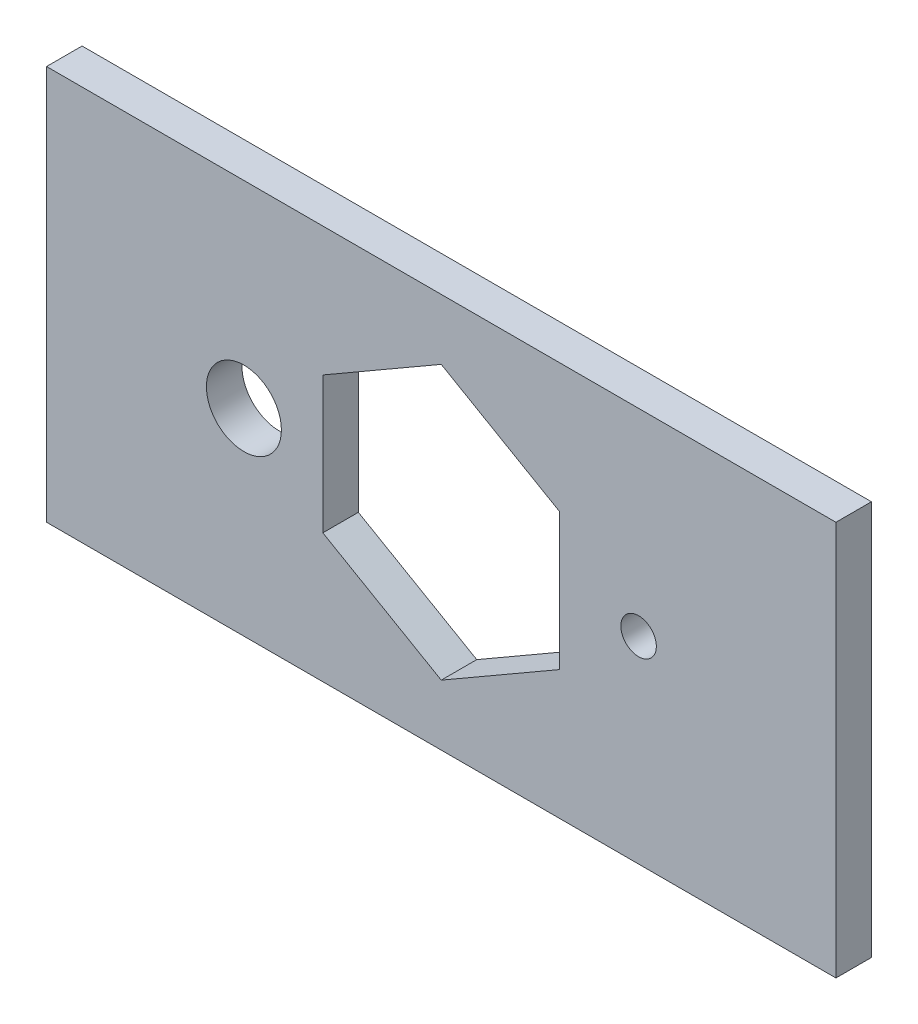
ISO-10303-21;
HEADER;
FILE_DESCRIPTION(('STEP AP214'),'2;1');
FILE_NAME('part.step','',(''),(''),'','','');
FILE_SCHEMA(('AUTOMOTIVE_DESIGN { 1 0 10303 214 1 1 1 1 }'));
ENDSEC;
DATA;
#1=APPLICATION_CONTEXT('core data for automotive mechanical design processes');
#2=APPLICATION_PROTOCOL_DEFINITION('international standard','automotive_design',2000,#1);
#3=PRODUCT_CONTEXT('',#1,'mechanical');
#4=PRODUCT('Part','Part','',(#3));
#5=PRODUCT_RELATED_PRODUCT_CATEGORY('part','',(#4));
#6=PRODUCT_DEFINITION_FORMATION('','',#4);
#7=PRODUCT_DEFINITION_CONTEXT('part definition',#1,'design');
#8=PRODUCT_DEFINITION('design','',#6,#7);
#9=PRODUCT_DEFINITION_SHAPE('','',#8);
#10=(LENGTH_UNIT() NAMED_UNIT(*) SI_UNIT(.MILLI.,.METRE.));
#11=(NAMED_UNIT(*) PLANE_ANGLE_UNIT() SI_UNIT($,.RADIAN.));
#12=(NAMED_UNIT(*) SI_UNIT($,.STERADIAN.) SOLID_ANGLE_UNIT());
#13=UNCERTAINTY_MEASURE_WITH_UNIT(LENGTH_MEASURE(1.E-05),#10,'distance_accuracy_value','');
#14=(GEOMETRIC_REPRESENTATION_CONTEXT(3) GLOBAL_UNCERTAINTY_ASSIGNED_CONTEXT((#13)) GLOBAL_UNIT_ASSIGNED_CONTEXT((#10,
#11,#12)) REPRESENTATION_CONTEXT('',''));
#15=CARTESIAN_POINT('',(0.,0.,0.));
#16=DIRECTION('',(0.,0.,1.));
#17=DIRECTION('',(1.,0.,0.));
#18=AXIS2_PLACEMENT_3D('',#15,#16,#17);
#19=CARTESIAN_POINT('',(0.,0.,1.143));
#20=DIRECTION('',(0.,0.,-1.));
#21=DIRECTION('',(-1.,0.,0.));
#22=AXIS2_PLACEMENT_3D('',#19,#20,#21);
#23=PLANE('',#22);
#24=CARTESIAN_POINT('',(-12.7,0.,1.143));
#25=DIRECTION('',(0.,0.,1.));
#26=DIRECTION('',(1.,0.,0.));
#27=AXIS2_PLACEMENT_3D('',#24,#25,#26);
#28=CIRCLE('',#27,2.413);
#29=CARTESIAN_POINT('',(-10.287,0.,1.143));
#30=VERTEX_POINT('',#29);
#31=EDGE_CURVE('E146',#30,#30,#28,.T.);
#32=ORIENTED_EDGE('',*,*,#31,.F.);
#33=EDGE_LOOP('',(#32));
#34=FACE_BOUND('',#33,.T.);
#35=DIRECTION('',(0.,1.,0.));
#36=VECTOR('',#35,1.);
#37=CARTESIAN_POINT('',(25.4,12.7,1.143));
#38=LINE('',#37,#36);
#39=CARTESIAN_POINT('',(25.4,-12.7,1.143));
#40=VERTEX_POINT('',#39);
#41=CARTESIAN_POINT('',(25.4,12.7,1.143));
#42=VERTEX_POINT('',#41);
#43=EDGE_CURVE('E166',#40,#42,#38,.T.);
#44=ORIENTED_EDGE('',*,*,#43,.T.);
#45=DIRECTION('',(-1.,0.,0.));
#46=VECTOR('',#45,1.);
#47=CARTESIAN_POINT('',(25.4,12.7,1.143));
#48=LINE('',#47,#46);
#49=CARTESIAN_POINT('',(-25.4,12.7,1.143));
#50=VERTEX_POINT('',#49);
#51=EDGE_CURVE('E169',#42,#50,#48,.T.);
#52=ORIENTED_EDGE('',*,*,#51,.T.);
#53=DIRECTION('',(0.,-1.,0.));
#54=VECTOR('',#53,1.);
#55=CARTESIAN_POINT('',(-25.4,12.7,1.143));
#56=LINE('',#55,#54);
#57=CARTESIAN_POINT('',(-25.4,-12.7,1.143));
#58=VERTEX_POINT('',#57);
#59=EDGE_CURVE('E172',#50,#58,#56,.T.);
#60=ORIENTED_EDGE('',*,*,#59,.T.);
#61=DIRECTION('',(1.,0.,0.));
#62=VECTOR('',#61,1.);
#63=CARTESIAN_POINT('',(25.4,-12.7,1.143));
#64=LINE('',#63,#62);
#65=EDGE_CURVE('E174',#58,#40,#64,.T.);
#66=ORIENTED_EDGE('',*,*,#65,.T.);
#67=EDGE_LOOP('',(#44,#52,#60,#66));
#68=FACE_BOUND('',#67,.T.);
#69=DIRECTION('',(0.,1.,0.));
#70=VECTOR('',#69,1.);
#71=CARTESIAN_POINT('',(7.62,-4.39940905122495,1.143));
#72=LINE('',#71,#70);
#73=CARTESIAN_POINT('',(7.62,-4.39940905122495,1.143));
#74=VERTEX_POINT('',#73);
#75=CARTESIAN_POINT('',(7.62,4.39940905122495,1.143));
#76=VERTEX_POINT('',#75);
#77=EDGE_CURVE('E112',#74,#76,#72,.T.);
#78=ORIENTED_EDGE('',*,*,#77,.F.);
#79=DIRECTION('',(0.866025403784439,0.5,0.));
#80=VECTOR('',#79,1.);
#81=CARTESIAN_POINT('',(0.,-8.7988181024499,1.143));
#82=LINE('',#81,#80);
#83=CARTESIAN_POINT('',(0.,-8.7988181024499,1.143));
#84=VERTEX_POINT('',#83);
#85=EDGE_CURVE('E143',#84,#74,#82,.T.);
#86=ORIENTED_EDGE('',*,*,#85,.F.);
#87=DIRECTION('',(0.866025403784439,-0.5,0.));
#88=VECTOR('',#87,1.);
#89=CARTESIAN_POINT('',(-7.62,-4.39940905122495,1.143));
#90=LINE('',#89,#88);
#91=CARTESIAN_POINT('',(-7.62,-4.39940905122495,1.143));
#92=VERTEX_POINT('',#91);
#93=EDGE_CURVE('E141',#92,#84,#90,.T.);
#94=ORIENTED_EDGE('',*,*,#93,.F.);
#95=DIRECTION('',(0.,-1.,0.));
#96=VECTOR('',#95,1.);
#97=CARTESIAN_POINT('',(-7.62,4.39940905122495,1.143));
#98=LINE('',#97,#96);
#99=CARTESIAN_POINT('',(-7.62,4.39940905122495,1.143));
#100=VERTEX_POINT('',#99);
#101=EDGE_CURVE('E136',#100,#92,#98,.T.);
#102=ORIENTED_EDGE('',*,*,#101,.F.);
#103=DIRECTION('',(-0.866025403784439,-0.5,0.));
#104=VECTOR('',#103,1.);
#105=CARTESIAN_POINT('',(0.,8.7988181024499,1.143));
#106=LINE('',#105,#104);
#107=CARTESIAN_POINT('',(0.,8.7988181024499,1.143));
#108=VERTEX_POINT('',#107);
#109=EDGE_CURVE('E134',#108,#100,#106,.T.);
#110=ORIENTED_EDGE('',*,*,#109,.F.);
#111=DIRECTION('',(-0.866025403784438,0.5,0.));
#112=VECTOR('',#111,1.);
#113=CARTESIAN_POINT('',(7.62,4.39940905122495,1.143));
#114=LINE('',#113,#112);
#115=EDGE_CURVE('E120',#76,#108,#114,.T.);
#116=ORIENTED_EDGE('',*,*,#115,.F.);
#117=EDGE_LOOP('',(#78,#86,#94,#102,#110,#116));
#118=FACE_BOUND('',#117,.T.);
#119=CARTESIAN_POINT('',(12.7,0.,1.143));
#120=DIRECTION('',(0.,0.,1.));
#121=DIRECTION('',(1.,0.,0.));
#122=AXIS2_PLACEMENT_3D('',#119,#120,#121);
#123=CIRCLE('',#122,1.143);
#124=CARTESIAN_POINT('',(13.843,0.,1.143));
#125=VERTEX_POINT('',#124);
#126=EDGE_CURVE('E265',#125,#125,#123,.T.);
#127=ORIENTED_EDGE('',*,*,#126,.F.);
#128=EDGE_LOOP('',(#127));
#129=FACE_BOUND('',#128,.T.);
#130=ADVANCED_FACE('F35',(#34,#68,#118,#129),#23,.F.);
#131=CARTESIAN_POINT('',(0.,0.,-1.143));
#132=DIRECTION('',(0.,0.,-1.));
#133=DIRECTION('',(-1.,0.,0.));
#134=AXIS2_PLACEMENT_3D('',#131,#132,#133);
#135=PLANE('',#134);
#136=CARTESIAN_POINT('',(-12.7,0.,-1.143));
#137=DIRECTION('',(0.,0.,1.));
#138=DIRECTION('',(1.,0.,0.));
#139=AXIS2_PLACEMENT_3D('',#136,#137,#138);
#140=CIRCLE('',#139,2.413);
#141=CARTESIAN_POINT('',(-10.287,0.,-1.143));
#142=VERTEX_POINT('',#141);
#143=EDGE_CURVE('E271',#142,#142,#140,.T.);
#144=ORIENTED_EDGE('',*,*,#143,.T.);
#145=EDGE_LOOP('',(#144));
#146=FACE_BOUND('',#145,.T.);
#147=DIRECTION('',(0.,1.,0.));
#148=VECTOR('',#147,1.);
#149=CARTESIAN_POINT('',(25.4,12.7,-1.143));
#150=LINE('',#149,#148);
#151=CARTESIAN_POINT('',(25.4,-12.7,-1.143));
#152=VERTEX_POINT('',#151);
#153=CARTESIAN_POINT('',(25.4,12.7,-1.143));
#154=VERTEX_POINT('',#153);
#155=EDGE_CURVE('E128',#152,#154,#150,.T.);
#156=ORIENTED_EDGE('',*,*,#155,.F.);
#157=DIRECTION('',(1.,0.,0.));
#158=VECTOR('',#157,1.);
#159=CARTESIAN_POINT('',(25.4,-12.7,-1.143));
#160=LINE('',#159,#158);
#161=CARTESIAN_POINT('',(-25.4,-12.7,-1.143));
#162=VERTEX_POINT('',#161);
#163=EDGE_CURVE('E170',#162,#152,#160,.T.);
#164=ORIENTED_EDGE('',*,*,#163,.F.);
#165=DIRECTION('',(0.,-1.,0.));
#166=VECTOR('',#165,1.);
#167=CARTESIAN_POINT('',(-25.4,12.7,-1.143));
#168=LINE('',#167,#166);
#169=CARTESIAN_POINT('',(-25.4,12.7,-1.143));
#170=VERTEX_POINT('',#169);
#171=EDGE_CURVE('E181',#170,#162,#168,.T.);
#172=ORIENTED_EDGE('',*,*,#171,.F.);
#173=DIRECTION('',(-1.,0.,0.));
#174=VECTOR('',#173,1.);
#175=CARTESIAN_POINT('',(25.4,12.7,-1.143));
#176=LINE('',#175,#174);
#177=EDGE_CURVE('E179',#154,#170,#176,.T.);
#178=ORIENTED_EDGE('',*,*,#177,.F.);
#179=EDGE_LOOP('',(#156,#164,#172,#178));
#180=FACE_BOUND('',#179,.T.);
#181=DIRECTION('',(0.866025403784439,0.5,0.));
#182=VECTOR('',#181,1.);
#183=CARTESIAN_POINT('',(0.,-8.7988181024499,-1.143));
#184=LINE('',#183,#182);
#185=CARTESIAN_POINT('',(0.,-8.7988181024499,-1.143));
#186=VERTEX_POINT('',#185);
#187=CARTESIAN_POINT('',(7.62,-4.39940905122495,-1.143));
#188=VERTEX_POINT('',#187);
#189=EDGE_CURVE('E121',#186,#188,#184,.T.);
#190=ORIENTED_EDGE('',*,*,#189,.T.);
#191=DIRECTION('',(0.,1.,0.));
#192=VECTOR('',#191,1.);
#193=CARTESIAN_POINT('',(7.62,-4.39940905122495,-1.143));
#194=LINE('',#193,#192);
#195=CARTESIAN_POINT('',(7.62,4.39940905122495,-1.143));
#196=VERTEX_POINT('',#195);
#197=EDGE_CURVE('E58',#188,#196,#194,.T.);
#198=ORIENTED_EDGE('',*,*,#197,.T.);
#199=DIRECTION('',(-0.866025403784438,0.5,0.));
#200=VECTOR('',#199,1.);
#201=CARTESIAN_POINT('',(7.62,4.39940905122495,-1.143));
#202=LINE('',#201,#200);
#203=CARTESIAN_POINT('',(0.,8.7988181024499,-1.143));
#204=VERTEX_POINT('',#203);
#205=EDGE_CURVE('E127',#196,#204,#202,.T.);
#206=ORIENTED_EDGE('',*,*,#205,.T.);
#207=DIRECTION('',(-0.866025403784439,-0.5,0.));
#208=VECTOR('',#207,1.);
#209=CARTESIAN_POINT('',(0.,8.7988181024499,-1.143));
#210=LINE('',#209,#208);
#211=CARTESIAN_POINT('',(-7.62,4.39940905122495,-1.143));
#212=VERTEX_POINT('',#211);
#213=EDGE_CURVE('E148',#204,#212,#210,.T.);
#214=ORIENTED_EDGE('',*,*,#213,.T.);
#215=DIRECTION('',(0.,-1.,0.));
#216=VECTOR('',#215,1.);
#217=CARTESIAN_POINT('',(-7.62,4.39940905122495,-1.143));
#218=LINE('',#217,#216);
#219=CARTESIAN_POINT('',(-7.62,-4.39940905122495,-1.143));
#220=VERTEX_POINT('',#219);
#221=EDGE_CURVE('E151',#212,#220,#218,.T.);
#222=ORIENTED_EDGE('',*,*,#221,.T.);
#223=DIRECTION('',(0.866025403784439,-0.5,0.));
#224=VECTOR('',#223,1.);
#225=CARTESIAN_POINT('',(-7.62,-4.39940905122495,-1.143));
#226=LINE('',#225,#224);
#227=EDGE_CURVE('E154',#220,#186,#226,.T.);
#228=ORIENTED_EDGE('',*,*,#227,.T.);
#229=EDGE_LOOP('',(#190,#198,#206,#214,#222,#228));
#230=FACE_BOUND('',#229,.T.);
#231=CARTESIAN_POINT('',(12.7,0.,-1.143));
#232=DIRECTION('',(0.,0.,1.));
#233=DIRECTION('',(1.,0.,0.));
#234=AXIS2_PLACEMENT_3D('',#231,#232,#233);
#235=CIRCLE('',#234,1.143);
#236=CARTESIAN_POINT('',(13.843,0.,-1.143));
#237=VERTEX_POINT('',#236);
#238=EDGE_CURVE('E268',#237,#237,#235,.T.);
#239=ORIENTED_EDGE('',*,*,#238,.T.);
#240=EDGE_LOOP('',(#239));
#241=FACE_BOUND('',#240,.T.);
#242=ADVANCED_FACE('F199',(#146,#180,#230,#241),#135,.T.);
#243=CARTESIAN_POINT('',(25.4,12.7,1.143));
#244=DIRECTION('',(-1.,0.,0.));
#245=DIRECTION('',(0.,0.,1.));
#246=AXIS2_PLACEMENT_3D('',#243,#244,#245);
#247=PLANE('',#246);
#248=ORIENTED_EDGE('',*,*,#155,.T.);
#249=DIRECTION('',(0.,0.,-1.));
#250=VECTOR('',#249,1.);
#251=CARTESIAN_POINT('',(25.4,12.7,1.143));
#252=LINE('',#251,#250);
#253=EDGE_CURVE('E11',#42,#154,#252,.T.);
#254=ORIENTED_EDGE('',*,*,#253,.F.);
#255=ORIENTED_EDGE('',*,*,#43,.F.);
#256=DIRECTION('',(0.,0.,-1.));
#257=VECTOR('',#256,1.);
#258=CARTESIAN_POINT('',(25.4,-12.7,1.143));
#259=LINE('',#258,#257);
#260=EDGE_CURVE('E176',#40,#152,#259,.T.);
#261=ORIENTED_EDGE('',*,*,#260,.T.);
#262=EDGE_LOOP('',(#248,#254,#255,#261));
#263=FACE_BOUND('',#262,.T.);
#264=ADVANCED_FACE('F37',(#263),#247,.F.);
#265=CARTESIAN_POINT('',(25.4,12.7,1.143));
#266=DIRECTION('',(0.,-1.,0.));
#267=DIRECTION('',(1.,0.,0.));
#268=AXIS2_PLACEMENT_3D('',#265,#266,#267);
#269=PLANE('',#268);
#270=ORIENTED_EDGE('',*,*,#177,.T.);
#271=DIRECTION('',(0.,0.,-1.));
#272=VECTOR('',#271,1.);
#273=CARTESIAN_POINT('',(-25.4,12.7,1.143));
#274=LINE('',#273,#272);
#275=EDGE_CURVE('E43',#50,#170,#274,.T.);
#276=ORIENTED_EDGE('',*,*,#275,.F.);
#277=ORIENTED_EDGE('',*,*,#51,.F.);
#278=ORIENTED_EDGE('',*,*,#253,.T.);
#279=EDGE_LOOP('',(#270,#276,#277,#278));
#280=FACE_BOUND('',#279,.T.);
#281=ADVANCED_FACE('F209',(#280),#269,.F.);
#282=CARTESIAN_POINT('',(-25.4,12.7,1.143));
#283=DIRECTION('',(1.,0.,0.));
#284=DIRECTION('',(0.,0.,-1.));
#285=AXIS2_PLACEMENT_3D('',#282,#283,#284);
#286=PLANE('',#285);
#287=ORIENTED_EDGE('',*,*,#171,.T.);
#288=DIRECTION('',(0.,0.,-1.));
#289=VECTOR('',#288,1.);
#290=CARTESIAN_POINT('',(-25.4,-12.7,1.143));
#291=LINE('',#290,#289);
#292=EDGE_CURVE('E186',#58,#162,#291,.T.);
#293=ORIENTED_EDGE('',*,*,#292,.F.);
#294=ORIENTED_EDGE('',*,*,#59,.F.);
#295=ORIENTED_EDGE('',*,*,#275,.T.);
#296=EDGE_LOOP('',(#287,#293,#294,#295));
#297=FACE_BOUND('',#296,.T.);
#298=ADVANCED_FACE('F193',(#297),#286,.F.);
#299=CARTESIAN_POINT('',(25.4,-12.7,1.143));
#300=DIRECTION('',(0.,1.,0.));
#301=DIRECTION('',(-1.,0.,0.));
#302=AXIS2_PLACEMENT_3D('',#299,#300,#301);
#303=PLANE('',#302);
#304=ORIENTED_EDGE('',*,*,#163,.T.);
#305=ORIENTED_EDGE('',*,*,#260,.F.);
#306=ORIENTED_EDGE('',*,*,#65,.F.);
#307=ORIENTED_EDGE('',*,*,#292,.T.);
#308=EDGE_LOOP('',(#304,#305,#306,#307));
#309=FACE_BOUND('',#308,.T.);
#310=ADVANCED_FACE('F203',(#309),#303,.F.);
#311=CARTESIAN_POINT('',(7.62,-4.39940905122495,1.143));
#312=DIRECTION('',(-1.,0.,0.));
#313=DIRECTION('',(0.,-1.,0.));
#314=AXIS2_PLACEMENT_3D('',#311,#312,#313);
#315=PLANE('',#314);
#316=ORIENTED_EDGE('',*,*,#197,.F.);
#317=DIRECTION('',(0.,0.,-1.));
#318=VECTOR('',#317,1.);
#319=CARTESIAN_POINT('',(7.62,-4.39940905122495,1.143));
#320=LINE('',#319,#318);
#321=EDGE_CURVE('E116',#74,#188,#320,.T.);
#322=ORIENTED_EDGE('',*,*,#321,.F.);
#323=ORIENTED_EDGE('',*,*,#77,.T.);
#324=DIRECTION('',(0.,0.,-1.));
#325=VECTOR('',#324,1.);
#326=CARTESIAN_POINT('',(7.62,4.39940905122495,1.143));
#327=LINE('',#326,#325);
#328=EDGE_CURVE('E115',#76,#196,#327,.T.);
#329=ORIENTED_EDGE('',*,*,#328,.T.);
#330=EDGE_LOOP('',(#316,#322,#323,#329));
#331=FACE_BOUND('',#330,.T.);
#332=ADVANCED_FACE('F114',(#331),#315,.T.);
#333=CARTESIAN_POINT('',(7.62,4.39940905122495,1.143));
#334=DIRECTION('',(-0.5,-0.866025403784438,0.));
#335=DIRECTION('',(0.866025403784439,-0.5,0.));
#336=AXIS2_PLACEMENT_3D('',#333,#334,#335);
#337=PLANE('',#336);
#338=ORIENTED_EDGE('',*,*,#205,.F.);
#339=ORIENTED_EDGE('',*,*,#328,.F.);
#340=ORIENTED_EDGE('',*,*,#115,.T.);
#341=DIRECTION('',(0.,0.,-1.));
#342=VECTOR('',#341,1.);
#343=CARTESIAN_POINT('',(0.,8.7988181024499,1.143));
#344=LINE('',#343,#342);
#345=EDGE_CURVE('E129',#108,#204,#344,.T.);
#346=ORIENTED_EDGE('',*,*,#345,.T.);
#347=EDGE_LOOP('',(#338,#339,#340,#346));
#348=FACE_BOUND('',#347,.T.);
#349=ADVANCED_FACE('F124',(#348),#337,.T.);
#350=CARTESIAN_POINT('',(0.,8.7988181024499,1.143));
#351=DIRECTION('',(0.5,-0.866025403784438,0.));
#352=DIRECTION('',(0.866025403784439,0.5,0.));
#353=AXIS2_PLACEMENT_3D('',#350,#351,#352);
#354=PLANE('',#353);
#355=ORIENTED_EDGE('',*,*,#213,.F.);
#356=ORIENTED_EDGE('',*,*,#345,.F.);
#357=ORIENTED_EDGE('',*,*,#109,.T.);
#358=DIRECTION('',(0.,0.,-1.));
#359=VECTOR('',#358,1.);
#360=CARTESIAN_POINT('',(-7.62,4.39940905122495,1.143));
#361=LINE('',#360,#359);
#362=EDGE_CURVE('E163',#100,#212,#361,.T.);
#363=ORIENTED_EDGE('',*,*,#362,.T.);
#364=EDGE_LOOP('',(#355,#356,#357,#363));
#365=FACE_BOUND('',#364,.T.);
#366=ADVANCED_FACE('F235',(#365),#354,.T.);
#367=CARTESIAN_POINT('',(-7.62,4.39940905122495,1.143));
#368=DIRECTION('',(1.,0.,0.));
#369=DIRECTION('',(0.,0.,-1.));
#370=AXIS2_PLACEMENT_3D('',#367,#368,#369);
#371=PLANE('',#370);
#372=ORIENTED_EDGE('',*,*,#221,.F.);
#373=ORIENTED_EDGE('',*,*,#362,.F.);
#374=ORIENTED_EDGE('',*,*,#101,.T.);
#375=DIRECTION('',(0.,0.,-1.));
#376=VECTOR('',#375,1.);
#377=CARTESIAN_POINT('',(-7.62,-4.39940905122495,1.143));
#378=LINE('',#377,#376);
#379=EDGE_CURVE('E161',#92,#220,#378,.T.);
#380=ORIENTED_EDGE('',*,*,#379,.T.);
#381=EDGE_LOOP('',(#372,#373,#374,#380));
#382=FACE_BOUND('',#381,.T.);
#383=ADVANCED_FACE('F239',(#382),#371,.T.);
#384=CARTESIAN_POINT('',(-7.62,-4.39940905122495,1.143));
#385=DIRECTION('',(0.5,0.866025403784439,0.));
#386=DIRECTION('',(-0.866025403784439,0.5,0.));
#387=AXIS2_PLACEMENT_3D('',#384,#385,#386);
#388=PLANE('',#387);
#389=ORIENTED_EDGE('',*,*,#227,.F.);
#390=ORIENTED_EDGE('',*,*,#379,.F.);
#391=ORIENTED_EDGE('',*,*,#93,.T.);
#392=DIRECTION('',(0.,0.,-1.));
#393=VECTOR('',#392,1.);
#394=CARTESIAN_POINT('',(0.,-8.7988181024499,1.143));
#395=LINE('',#394,#393);
#396=EDGE_CURVE('E50',#84,#186,#395,.T.);
#397=ORIENTED_EDGE('',*,*,#396,.T.);
#398=EDGE_LOOP('',(#389,#390,#391,#397));
#399=FACE_BOUND('',#398,.T.);
#400=ADVANCED_FACE('F245',(#399),#388,.T.);
#401=CARTESIAN_POINT('',(0.,-8.7988181024499,1.143));
#402=DIRECTION('',(-0.5,0.866025403784439,0.));
#403=DIRECTION('',(-0.866025403784439,-0.5,0.));
#404=AXIS2_PLACEMENT_3D('',#401,#402,#403);
#405=PLANE('',#404);
#406=ORIENTED_EDGE('',*,*,#189,.F.);
#407=ORIENTED_EDGE('',*,*,#396,.F.);
#408=ORIENTED_EDGE('',*,*,#85,.T.);
#409=ORIENTED_EDGE('',*,*,#321,.T.);
#410=EDGE_LOOP('',(#406,#407,#408,#409));
#411=FACE_BOUND('',#410,.T.);
#412=ADVANCED_FACE('F249',(#411),#405,.T.);
#413=CARTESIAN_POINT('',(-12.7,0.,1.143));
#414=DIRECTION('',(0.,0.,-1.));
#415=DIRECTION('',(-1.,0.,0.));
#416=AXIS2_PLACEMENT_3D('',#413,#414,#415);
#417=CYLINDRICAL_SURFACE('',#416,2.413);
#418=ORIENTED_EDGE('',*,*,#31,.T.);
#419=EDGE_LOOP('',(#418));
#420=FACE_BOUND('',#419,.T.);
#421=ORIENTED_EDGE('',*,*,#143,.F.);
#422=EDGE_LOOP('',(#421));
#423=FACE_BOUND('',#422,.T.);
#424=ADVANCED_FACE('F253',(#420,#423),#417,.F.);
#425=CARTESIAN_POINT('',(12.7,0.,1.143));
#426=DIRECTION('',(0.,0.,-1.));
#427=DIRECTION('',(-1.,0.,0.));
#428=AXIS2_PLACEMENT_3D('',#425,#426,#427);
#429=CYLINDRICAL_SURFACE('',#428,1.143);
#430=ORIENTED_EDGE('',*,*,#126,.T.);
#431=EDGE_LOOP('',(#430));
#432=FACE_BOUND('',#431,.T.);
#433=ORIENTED_EDGE('',*,*,#238,.F.);
#434=EDGE_LOOP('',(#433));
#435=FACE_BOUND('',#434,.T.);
#436=ADVANCED_FACE('F256',(#432,#435),#429,.F.);
#437=CLOSED_SHELL('',(#130,#242,#264,#281,#298,#310,#332,#349,#366,#383,#400,#412,#424,#436));
#438=MANIFOLD_SOLID_BREP('B2',#437);
#439=ADVANCED_BREP_SHAPE_REPRESENTATION('',(#18,#438),#14);
#440=SHAPE_DEFINITION_REPRESENTATION(#9,#439);
ENDSEC;
END-ISO-10303-21;
